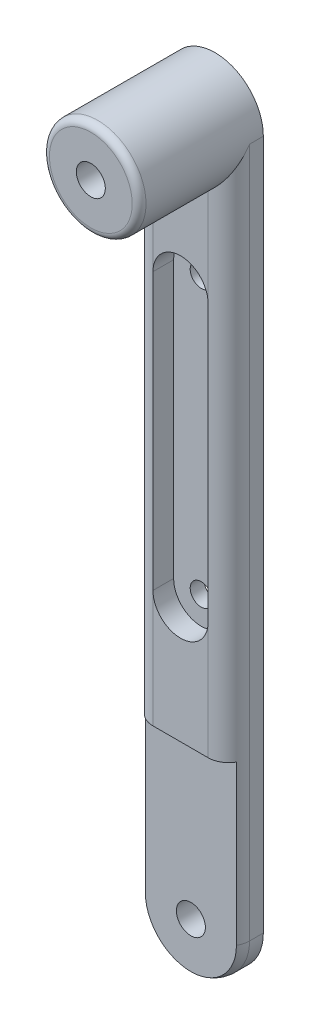
ISO-10303-21;
HEADER;
FILE_DESCRIPTION(('STEP AP214'),'2;1');
FILE_NAME('part.step','',(''),(''),'','','');
FILE_SCHEMA(('AUTOMOTIVE_DESIGN { 1 0 10303 214 1 1 1 1 }'));
ENDSEC;
DATA;
#1=APPLICATION_CONTEXT('core data for automotive mechanical design processes');
#2=APPLICATION_PROTOCOL_DEFINITION('international standard','automotive_design',2000,#1);
#3=PRODUCT_CONTEXT('',#1,'mechanical');
#4=PRODUCT('Part','Part','',(#3));
#5=PRODUCT_RELATED_PRODUCT_CATEGORY('part','',(#4));
#6=PRODUCT_DEFINITION_FORMATION('','',#4);
#7=PRODUCT_DEFINITION_CONTEXT('part definition',#1,'design');
#8=PRODUCT_DEFINITION('design','',#6,#7);
#9=PRODUCT_DEFINITION_SHAPE('','',#8);
#10=(LENGTH_UNIT() NAMED_UNIT(*) SI_UNIT(.MILLI.,.METRE.));
#11=(NAMED_UNIT(*) PLANE_ANGLE_UNIT() SI_UNIT($,.RADIAN.));
#12=(NAMED_UNIT(*) SI_UNIT($,.STERADIAN.) SOLID_ANGLE_UNIT());
#13=UNCERTAINTY_MEASURE_WITH_UNIT(LENGTH_MEASURE(1.E-05),#10,'distance_accuracy_value','');
#14=(GEOMETRIC_REPRESENTATION_CONTEXT(3) GLOBAL_UNCERTAINTY_ASSIGNED_CONTEXT((#13)) GLOBAL_UNIT_ASSIGNED_CONTEXT((#10,
#11,#12)) REPRESENTATION_CONTEXT('',''));
#15=CARTESIAN_POINT('',(0.,0.,0.));
#16=DIRECTION('',(0.,0.,1.));
#17=DIRECTION('',(1.,0.,0.));
#18=AXIS2_PLACEMENT_3D('',#15,#16,#17);
#19=CARTESIAN_POINT('',(0.,-100.,2.));
#20=DIRECTION('',(0.,0.,1.));
#21=DIRECTION('',(1.,0.,0.));
#22=AXIS2_PLACEMENT_3D('',#19,#20,#21);
#23=TOROIDAL_SURFACE('',#22,4.,3.);
#24=CARTESIAN_POINT('',(4.00000000000001,-100.,2.));
#25=DIRECTION('',(0.,-1.,0.));
#26=DIRECTION('',(0.,0.,-1.));
#27=AXIS2_PLACEMENT_3D('',#24,#25,#26);
#28=CIRCLE('',#27,3.);
#29=CARTESIAN_POINT('',(7.00000000000001,-100.,2.));
#30=VERTEX_POINT('',#29);
#31=CARTESIAN_POINT('',(6.59807621135332,-100.,3.5));
#32=VERTEX_POINT('',#31);
#33=EDGE_CURVE('E207',#30,#32,#28,.T.);
#34=ORIENTED_EDGE('',*,*,#33,.T.);
#35=CARTESIAN_POINT('',(0.,-100.,3.5));
#36=DIRECTION('',(0.,0.,1.));
#37=DIRECTION('',(1.,0.,0.));
#38=AXIS2_PLACEMENT_3D('',#35,#36,#37);
#39=CIRCLE('',#38,6.59807621135332);
#40=CARTESIAN_POINT('',(-6.59807621135331,-100.,3.5));
#41=VERTEX_POINT('',#40);
#42=EDGE_CURVE('E138',#32,#41,#39,.F.);
#43=ORIENTED_EDGE('',*,*,#42,.T.);
#44=CARTESIAN_POINT('',(-3.99999999999999,-100.,2.));
#45=DIRECTION('',(0.,-1.,0.));
#46=DIRECTION('',(0.,0.,-1.));
#47=AXIS2_PLACEMENT_3D('',#44,#45,#46);
#48=CIRCLE('',#47,3.);
#49=CARTESIAN_POINT('',(-6.99999999999999,-100.,2.));
#50=VERTEX_POINT('',#49);
#51=EDGE_CURVE('E210',#41,#50,#48,.T.);
#52=ORIENTED_EDGE('',*,*,#51,.T.);
#53=CARTESIAN_POINT('',(0.,-100.,2.));
#54=DIRECTION('',(0.,0.,1.));
#55=DIRECTION('',(1.,0.,0.));
#56=AXIS2_PLACEMENT_3D('',#53,#54,#55);
#57=CIRCLE('',#56,7.);
#58=EDGE_CURVE('E151',#30,#50,#57,.F.);
#59=ORIENTED_EDGE('',*,*,#58,.F.);
#60=EDGE_LOOP('',(#34,#43,#52,#59));
#61=FACE_BOUND('',#60,.T.);
#62=ADVANCED_FACE('F39',(#61),#23,.T.);
#63=CARTESIAN_POINT('',(0.,0.,5.));
#64=DIRECTION('',(0.,0.,1.));
#65=DIRECTION('',(1.,0.,0.));
#66=AXIS2_PLACEMENT_3D('',#63,#64,#65);
#67=PLANE('',#66);
#68=CARTESIAN_POINT('',(0.,-20.,5.));
#69=DIRECTION('',(0.,0.,1.));
#70=DIRECTION('',(1.,0.,0.));
#71=AXIS2_PLACEMENT_3D('',#68,#69,#70);
#72=CIRCLE('',#71,3.99999999999998);
#73=CARTESIAN_POINT('',(3.99999999999999,-20.,5.));
#74=VERTEX_POINT('',#73);
#75=CARTESIAN_POINT('',(-3.99999999999997,-20.,5.));
#76=VERTEX_POINT('',#75);
#77=EDGE_CURVE('E290',#74,#76,#72,.T.);
#78=ORIENTED_EDGE('',*,*,#77,.F.);
#79=DIRECTION('',(0.,1.,0.));
#80=VECTOR('',#79,1.);
#81=CARTESIAN_POINT('',(4.,0.,5.));
#82=LINE('',#81,#80);
#83=CARTESIAN_POINT('',(4.,-5.74456264653803,5.));
#84=VERTEX_POINT('',#83);
#85=EDGE_CURVE('E152',#74,#84,#82,.T.);
#86=ORIENTED_EDGE('',*,*,#85,.T.);
#87=CARTESIAN_POINT('',(0.,0.,5.));
#88=DIRECTION('',(0.,0.,1.));
#89=DIRECTION('',(1.,0.,0.));
#90=AXIS2_PLACEMENT_3D('',#87,#88,#89);
#91=CIRCLE('',#90,7.);
#92=CARTESIAN_POINT('',(-4.,-5.74456264653803,5.));
#93=VERTEX_POINT('',#92);
#94=EDGE_CURVE('E257',#93,#84,#91,.T.);
#95=ORIENTED_EDGE('',*,*,#94,.F.);
#96=DIRECTION('',(0.,-1.,0.));
#97=VECTOR('',#96,1.);
#98=CARTESIAN_POINT('',(-3.99999999999999,-100.,5.));
#99=LINE('',#98,#97);
#100=EDGE_CURVE('E157',#93,#76,#99,.T.);
#101=ORIENTED_EDGE('',*,*,#100,.T.);
#102=EDGE_LOOP('',(#78,#86,#95,#101));
#103=FACE_BOUND('',#102,.T.);
#104=ADVANCED_FACE('F197',(#103),#67,.T.);
#105=CARTESIAN_POINT('',(0.,0.,18.));
#106=DIRECTION('',(0.,0.,-1.));
#107=DIRECTION('',(-1.,0.,0.));
#108=AXIS2_PLACEMENT_3D('',#105,#106,#107);
#109=CYLINDRICAL_SURFACE('',#108,7.);
#110=CARTESIAN_POINT('',(0.,0.,17.));
#111=DIRECTION('',(0.,0.,1.));
#112=DIRECTION('',(1.,0.,0.));
#113=AXIS2_PLACEMENT_3D('',#110,#111,#112);
#114=CIRCLE('',#113,7.);
#115=CARTESIAN_POINT('',(7.,0.,17.));
#116=VERTEX_POINT('',#115);
#117=EDGE_CURVE('E11',#116,#116,#114,.F.);
#118=ORIENTED_EDGE('',*,*,#117,.T.);
#119=EDGE_LOOP('',(#118));
#120=FACE_BOUND('',#119,.T.);
#121=DIRECTION('',(0.,0.,-1.));
#122=VECTOR('',#121,1.);
#123=CARTESIAN_POINT('',(-7.,0.,5.));
#124=LINE('',#123,#122);
#125=CARTESIAN_POINT('',(-7.,0.,2.));
#126=VERTEX_POINT('',#125);
#127=CARTESIAN_POINT('',(-7.,0.,0.));
#128=VERTEX_POINT('',#127);
#129=EDGE_CURVE('E238',#126,#128,#124,.T.);
#130=ORIENTED_EDGE('',*,*,#129,.F.);
#131=CARTESIAN_POINT('',(-4.,-5.74456264653803,5.));
#132=CARTESIAN_POINT('',(-4.10560056796325,-5.67106469962434,4.99999204849266));
#133=CARTESIAN_POINT('',(-4.20905142376086,-5.59467720100948,4.99442769333087));
#134=CARTESIAN_POINT('',(-4.41080801779257,-5.43700552068477,4.97346760596443));
#135=CARTESIAN_POINT('',(-4.50912336120114,-5.35573114025841,4.9580909945642));
#136=CARTESIAN_POINT('',(-4.69917329407143,-5.18975480068039,4.91898482455378));
#137=CARTESIAN_POINT('',(-4.79096624771771,-5.10509791169259,4.89534487001315));
#138=CARTESIAN_POINT('',(-4.96884628939413,-4.9321357332573,4.84077401315519));
#139=CARTESIAN_POINT('',(-5.0549297430738,-4.84382817695736,4.8098385229041));
#140=CARTESIAN_POINT('',(-5.24998768852349,-4.6330105694876,4.72986601789085));
#141=CARTESIAN_POINT('',(-5.35656360814947,-4.50924804562533,4.67827055097875));
#142=CARTESIAN_POINT('',(-5.55893618260416,-4.25727146470626,4.5657604340252));
#143=CARTESIAN_POINT('',(-5.65473085178413,-4.12905659330491,4.50484407215645));
#144=CARTESIAN_POINT('',(-5.83621176415536,-3.86833289087036,4.37504527308633));
#145=CARTESIAN_POINT('',(-5.92183863028728,-3.73580409442229,4.30612028884907));
#146=CARTESIAN_POINT('',(-6.08264567432005,-3.46783086204423,4.16200073185211));
#147=CARTESIAN_POINT('',(-6.15782273871987,-3.33238557097271,4.08680430115732));
#148=CARTESIAN_POINT('',(-6.32685567517654,-3.00297512190633,3.89936148940422));
#149=CARTESIAN_POINT('',(-6.41567942504996,-2.80785026043894,3.78459565275172));
#150=CARTESIAN_POINT('',(-6.57392969805323,-2.41422354712003,3.54764095417837));
#151=CARTESIAN_POINT('',(-6.64334692994569,-2.21572012580261,3.42544857062339));
#152=CARTESIAN_POINT('',(-6.76333415409406,-1.81676080636745,3.17605094483991));
#153=CARTESIAN_POINT('',(-6.81393867500258,-1.61630918509485,3.04885536486981));
#154=CARTESIAN_POINT('',(-6.89698633772744,-1.2139797240236,2.79107276025933));
#155=CARTESIAN_POINT('',(-6.92943852375573,-1.01210264530744,2.66048745851133));
#156=CARTESIAN_POINT('',(-6.96842425819762,-0.677380108501033,2.44284499860543));
#157=CARTESIAN_POINT('',(-6.98003745073094,-0.54475385437928,2.35631798354302));
#158=CARTESIAN_POINT('',(-6.99568259306756,-0.279411950065175,2.18291291800331));
#159=CARTESIAN_POINT('',(-6.9997206298678,-0.14669645744637,2.09603520563809));
#160=CARTESIAN_POINT('',(-6.99999533256514,-0.0093333097778525,2.00611008573063));
#161=CARTESIAN_POINT('',(-6.99999999911157,-0.00466664057309182,2.00305503339743));
#162=CARTESIAN_POINT('',(-7.,0.,2.));
#163=B_SPLINE_CURVE_WITH_KNOTS('',3,(#131,#132,#133,#134,#135,#136,#137,#138,#139,#140,#141,
#142,#143,#144,#145,#146,#147,#148,#149,#150,#151,#152,#153,#154,#155,#156,#157,#158,#159,#160,
#161,#162),.UNSPECIFIED.,.F.,.F.,(4,2,2,2,2,2,2,2,2,2,2,2,2,2,2,4),(0.,0.38564717377713,
0.770545135607862,1.15139266981324,1.53248034878109,2.04556248030352,2.55873895518642,
3.07477846543134,3.5909714007265,4.31944082591672,5.04825842465059,5.77573167663153,
6.50284214904388,6.97903025788018,7.45483556281199,7.47156876920095),.UNSPECIFIED.);
#164=EDGE_CURVE('E172',#126,#93,#163,.F.);
#165=ORIENTED_EDGE('',*,*,#164,.T.);
#166=ORIENTED_EDGE('',*,*,#94,.T.);
#167=CARTESIAN_POINT('',(4.,-5.74456264653803,5.));
#168=CARTESIAN_POINT('',(4.10560056796326,-5.67106469962434,4.99999204849266));
#169=CARTESIAN_POINT('',(4.20905142376086,-5.59467720100947,4.99442769333087));
#170=CARTESIAN_POINT('',(4.41080801779257,-5.43700552068477,4.97346760596443));
#171=CARTESIAN_POINT('',(4.50912336120114,-5.35573114025841,4.9580909945642));
#172=CARTESIAN_POINT('',(4.69917329407143,-5.18975480068039,4.91898482455378));
#173=CARTESIAN_POINT('',(4.79096624771772,-5.10509791169259,4.89534487001315));
#174=CARTESIAN_POINT('',(4.96884628939413,-4.9321357332573,4.84077401315519));
#175=CARTESIAN_POINT('',(5.0549297430738,-4.84382817695736,4.8098385229041));
#176=CARTESIAN_POINT('',(5.24998768852349,-4.6330105694876,4.72986601789085));
#177=CARTESIAN_POINT('',(5.35656360814947,-4.50924804562533,4.67827055097875));
#178=CARTESIAN_POINT('',(5.55893618260416,-4.25727146470626,4.5657604340252));
#179=CARTESIAN_POINT('',(5.65473085178413,-4.12905659330491,4.50484407215645));
#180=CARTESIAN_POINT('',(5.83621176415536,-3.86833289087036,4.37504527308633));
#181=CARTESIAN_POINT('',(5.92183863028728,-3.73580409442229,4.30612028884907));
#182=CARTESIAN_POINT('',(6.08264567432005,-3.46783086204423,4.16200073185211));
#183=CARTESIAN_POINT('',(6.15782273871987,-3.33238557097271,4.08680430115732));
#184=CARTESIAN_POINT('',(6.32685567517654,-3.00297512190633,3.89936148940423));
#185=CARTESIAN_POINT('',(6.41567942504996,-2.80785026043894,3.78459565275172));
#186=CARTESIAN_POINT('',(6.57392969805323,-2.41422354712003,3.54764095417837));
#187=CARTESIAN_POINT('',(6.64334692994569,-2.21572012580261,3.42544857062339));
#188=CARTESIAN_POINT('',(6.76333415409406,-1.81676080636745,3.17605094483991));
#189=CARTESIAN_POINT('',(6.81393867500258,-1.61630918509485,3.04885536486981));
#190=CARTESIAN_POINT('',(6.89698633772744,-1.2139797240236,2.79107276025933));
#191=CARTESIAN_POINT('',(6.92943852375573,-1.01210264530744,2.66048745851133));
#192=CARTESIAN_POINT('',(6.96842425819762,-0.677380108501032,2.44284499860543));
#193=CARTESIAN_POINT('',(6.98003745073094,-0.544753854379276,2.35631798354303));
#194=CARTESIAN_POINT('',(6.99568259306756,-0.27941195006518,2.1829129180033));
#195=CARTESIAN_POINT('',(6.9997206298678,-0.146696457446387,2.09603520563806));
#196=CARTESIAN_POINT('',(6.99999533256514,-0.00933330977785193,2.00611008573063));
#197=CARTESIAN_POINT('',(6.99999999911157,-0.0046666405730907,2.00305503339743));
#198=CARTESIAN_POINT('',(7.,0.,2.));
#199=B_SPLINE_CURVE_WITH_KNOTS('',3,(#167,#168,#169,#170,#171,#172,#173,#174,#175,#176,#177,
#178,#179,#180,#181,#182,#183,#184,#185,#186,#187,#188,#189,#190,#191,#192,#193,#194,#195,#196,
#197,#198),.UNSPECIFIED.,.F.,.F.,(4,2,2,2,2,2,2,2,2,2,2,2,2,2,2,4),(0.,0.38564717377713,
0.770545135607862,1.15139266981324,1.53248034878109,2.04556248030352,2.55873895518642,
3.07477846543134,3.5909714007265,4.31944082591671,5.04825842465059,5.77573167663153,
6.50284214904387,6.97903025788018,7.45483556281199,7.47156876920095),.UNSPECIFIED.);
#200=CARTESIAN_POINT('',(7.,0.,2.));
#201=VERTEX_POINT('',#200);
#202=EDGE_CURVE('E164',#84,#201,#199,.T.);
#203=ORIENTED_EDGE('',*,*,#202,.T.);
#204=DIRECTION('',(0.,0.,-1.));
#205=VECTOR('',#204,1.);
#206=CARTESIAN_POINT('',(7.,0.,5.));
#207=LINE('',#206,#205);
#208=CARTESIAN_POINT('',(7.,0.,0.));
#209=VERTEX_POINT('',#208);
#210=EDGE_CURVE('E247',#201,#209,#207,.T.);
#211=ORIENTED_EDGE('',*,*,#210,.T.);
#212=CARTESIAN_POINT('',(0.,0.,0.));
#213=DIRECTION('',(0.,0.,1.));
#214=DIRECTION('',(1.,0.,0.));
#215=AXIS2_PLACEMENT_3D('',#212,#213,#214);
#216=CIRCLE('',#215,7.);
#217=EDGE_CURVE('E243',#209,#128,#216,.T.);
#218=ORIENTED_EDGE('',*,*,#217,.T.);
#219=EDGE_LOOP('',(#130,#165,#166,#203,#211,#218));
#220=FACE_BOUND('',#219,.T.);
#221=ADVANCED_FACE('F178',(#120,#220),#109,.T.);
#222=CARTESIAN_POINT('',(0.,0.,18.));
#223=DIRECTION('',(0.,0.,1.));
#224=DIRECTION('',(1.,0.,0.));
#225=AXIS2_PLACEMENT_3D('',#222,#223,#224);
#226=PLANE('',#225);
#227=CARTESIAN_POINT('',(0.,0.,18.));
#228=DIRECTION('',(0.,0.,1.));
#229=DIRECTION('',(1.,0.,0.));
#230=AXIS2_PLACEMENT_3D('',#227,#228,#229);
#231=CIRCLE('',#230,6.);
#232=CARTESIAN_POINT('',(6.,0.,18.));
#233=VERTEX_POINT('',#232);
#234=EDGE_CURVE('E47',#233,#233,#231,.T.);
#235=ORIENTED_EDGE('',*,*,#234,.T.);
#236=EDGE_LOOP('',(#235));
#237=FACE_BOUND('',#236,.T.);
#238=CARTESIAN_POINT('',(0.,0.,18.));
#239=DIRECTION('',(0.,0.,1.));
#240=DIRECTION('',(1.,0.,0.));
#241=AXIS2_PLACEMENT_3D('',#238,#239,#240);
#242=CIRCLE('',#241,2.1);
#243=CARTESIAN_POINT('',(2.1,0.,18.));
#244=VERTEX_POINT('',#243);
#245=EDGE_CURVE('E271',#244,#244,#242,.T.);
#246=ORIENTED_EDGE('',*,*,#245,.F.);
#247=EDGE_LOOP('',(#246));
#248=FACE_BOUND('',#247,.T.);
#249=ADVANCED_FACE('F220',(#237,#248),#226,.T.);
#250=CARTESIAN_POINT('',(0.,0.,0.));
#251=DIRECTION('',(0.,0.,1.));
#252=DIRECTION('',(1.,0.,0.));
#253=AXIS2_PLACEMENT_3D('',#250,#251,#252);
#254=PLANE('',#253);
#255=CARTESIAN_POINT('',(0.,-100.,0.));
#256=DIRECTION('',(0.,0.,1.));
#257=DIRECTION('',(1.,0.,0.));
#258=AXIS2_PLACEMENT_3D('',#255,#256,#257);
#259=CIRCLE('',#258,2.1);
#260=CARTESIAN_POINT('',(2.1,-100.,0.));
#261=VERTEX_POINT('',#260);
#262=EDGE_CURVE('E144',#261,#261,#259,.T.);
#263=ORIENTED_EDGE('',*,*,#262,.T.);
#264=EDGE_LOOP('',(#263));
#265=FACE_BOUND('',#264,.T.);
#266=CARTESIAN_POINT('',(0.,-20.,0.));
#267=DIRECTION('',(0.,0.,1.));
#268=DIRECTION('',(1.,0.,0.));
#269=AXIS2_PLACEMENT_3D('',#266,#267,#268);
#270=CIRCLE('',#269,1.6);
#271=CARTESIAN_POINT('',(1.59999999999999,-20.,0.));
#272=VERTEX_POINT('',#271);
#273=EDGE_CURVE('E293',#272,#272,#270,.T.);
#274=ORIENTED_EDGE('',*,*,#273,.T.);
#275=EDGE_LOOP('',(#274));
#276=FACE_BOUND('',#275,.T.);
#277=CARTESIAN_POINT('',(0.,-60.,0.));
#278=DIRECTION('',(0.,0.,1.));
#279=DIRECTION('',(1.,0.,0.));
#280=AXIS2_PLACEMENT_3D('',#277,#278,#279);
#281=CIRCLE('',#280,1.6);
#282=CARTESIAN_POINT('',(1.59999999999999,-60.,0.));
#283=VERTEX_POINT('',#282);
#284=EDGE_CURVE('E306',#283,#283,#281,.T.);
#285=ORIENTED_EDGE('',*,*,#284,.T.);
#286=EDGE_LOOP('',(#285));
#287=FACE_BOUND('',#286,.T.);
#288=CARTESIAN_POINT('',(0.,0.,0.));
#289=DIRECTION('',(0.,0.,1.));
#290=DIRECTION('',(1.,0.,0.));
#291=AXIS2_PLACEMENT_3D('',#288,#289,#290);
#292=CIRCLE('',#291,2.1);
#293=CARTESIAN_POINT('',(2.1,0.,0.));
#294=VERTEX_POINT('',#293);
#295=EDGE_CURVE('E270',#294,#294,#292,.T.);
#296=ORIENTED_EDGE('',*,*,#295,.T.);
#297=EDGE_LOOP('',(#296));
#298=FACE_BOUND('',#297,.T.);
#299=DIRECTION('',(0.,1.,0.));
#300=VECTOR('',#299,1.);
#301=CARTESIAN_POINT('',(7.,0.,0.));
#302=LINE('',#301,#300);
#303=CARTESIAN_POINT('',(7.00000000000001,-100.,0.));
#304=VERTEX_POINT('',#303);
#305=EDGE_CURVE('E248',#304,#209,#302,.T.);
#306=ORIENTED_EDGE('',*,*,#305,.F.);
#307=CARTESIAN_POINT('',(0.,-100.,0.));
#308=DIRECTION('',(0.,0.,1.));
#309=DIRECTION('',(1.,0.,0.));
#310=AXIS2_PLACEMENT_3D('',#307,#308,#309);
#311=CIRCLE('',#310,7.);
#312=CARTESIAN_POINT('',(-7.,-100.,0.));
#313=VERTEX_POINT('',#312);
#314=EDGE_CURVE('E212',#313,#304,#311,.T.);
#315=ORIENTED_EDGE('',*,*,#314,.F.);
#316=DIRECTION('',(0.,-1.,0.));
#317=VECTOR('',#316,1.);
#318=CARTESIAN_POINT('',(-7.,0.,0.));
#319=LINE('',#318,#317);
#320=EDGE_CURVE('E268',#128,#313,#319,.T.);
#321=ORIENTED_EDGE('',*,*,#320,.F.);
#322=ORIENTED_EDGE('',*,*,#217,.F.);
#323=EDGE_LOOP('',(#306,#315,#321,#322));
#324=FACE_BOUND('',#323,.T.);
#325=ADVANCED_FACE('F336',(#265,#276,#287,#298,#324),#254,.F.);
#326=CARTESIAN_POINT('',(-7.,0.,5.));
#327=DIRECTION('',(1.,0.,0.));
#328=DIRECTION('',(0.,1.,0.));
#329=AXIS2_PLACEMENT_3D('',#326,#327,#328);
#330=PLANE('',#329);
#331=DIRECTION('',(0.,0.,-1.));
#332=VECTOR('',#331,1.);
#333=CARTESIAN_POINT('',(-6.99999999999999,-100.,5.));
#334=LINE('',#333,#332);
#335=EDGE_CURVE('E259',#50,#313,#334,.T.);
#336=ORIENTED_EDGE('',*,*,#335,.F.);
#337=DIRECTION('',(0.,-1.,0.));
#338=VECTOR('',#337,1.);
#339=CARTESIAN_POINT('',(-7.,0.,2.));
#340=LINE('',#339,#338);
#341=EDGE_CURVE('E162',#50,#126,#340,.F.);
#342=ORIENTED_EDGE('',*,*,#341,.T.);
#343=ORIENTED_EDGE('',*,*,#129,.T.);
#344=ORIENTED_EDGE('',*,*,#320,.T.);
#345=EDGE_LOOP('',(#336,#342,#343,#344));
#346=FACE_BOUND('',#345,.T.);
#347=ADVANCED_FACE('F333',(#346),#330,.F.);
#348=CARTESIAN_POINT('',(7.,0.,5.));
#349=DIRECTION('',(-1.,0.,0.));
#350=DIRECTION('',(0.,-1.,0.));
#351=AXIS2_PLACEMENT_3D('',#348,#349,#350);
#352=PLANE('',#351);
#353=ORIENTED_EDGE('',*,*,#210,.F.);
#354=DIRECTION('',(0.,1.,0.));
#355=VECTOR('',#354,1.);
#356=CARTESIAN_POINT('',(7.00000000000001,-100.,2.));
#357=LINE('',#356,#355);
#358=EDGE_CURVE('E155',#201,#30,#357,.F.);
#359=ORIENTED_EDGE('',*,*,#358,.T.);
#360=DIRECTION('',(0.,0.,-1.));
#361=VECTOR('',#360,1.);
#362=CARTESIAN_POINT('',(7.00000000000001,-100.,5.));
#363=LINE('',#362,#361);
#364=EDGE_CURVE('E263',#30,#304,#363,.T.);
#365=ORIENTED_EDGE('',*,*,#364,.T.);
#366=ORIENTED_EDGE('',*,*,#305,.T.);
#367=EDGE_LOOP('',(#353,#359,#365,#366));
#368=FACE_BOUND('',#367,.T.);
#369=ADVANCED_FACE('F339',(#368),#352,.F.);
#370=DIRECTION('',(-1.,0.,0.));
#371=VECTOR('',#370,1.);
#372=CARTESIAN_POINT('',(-6.99999999999999,-77.,5.));
#373=LINE('',#372,#371);
#374=CARTESIAN_POINT('',(4.00000000000001,-77.,5.));
#375=VERTEX_POINT('',#374);
#376=CARTESIAN_POINT('',(-3.99999999999999,-77.,5.));
#377=VERTEX_POINT('',#376);
#378=EDGE_CURVE('E133',#375,#377,#373,.T.);
#379=ORIENTED_EDGE('',*,*,#378,.F.);
#380=CARTESIAN_POINT('',(4.00000000000001,-60.,5.));
#381=VERTEX_POINT('',#380);
#382=EDGE_CURVE('E62',#375,#381,#82,.T.);
#383=ORIENTED_EDGE('',*,*,#382,.T.);
#384=CARTESIAN_POINT('',(0.,-60.,5.));
#385=DIRECTION('',(0.,0.,1.));
#386=DIRECTION('',(1.,0.,0.));
#387=AXIS2_PLACEMENT_3D('',#384,#385,#386);
#388=CIRCLE('',#387,3.99999999999998);
#389=CARTESIAN_POINT('',(-3.99999999999999,-60.,5.));
#390=VERTEX_POINT('',#389);
#391=EDGE_CURVE('E287',#390,#381,#388,.T.);
#392=ORIENTED_EDGE('',*,*,#391,.F.);
#393=EDGE_CURVE('E143',#390,#377,#99,.T.);
#394=ORIENTED_EDGE('',*,*,#393,.T.);
#395=EDGE_LOOP('',(#379,#383,#392,#394));
#396=FACE_BOUND('',#395,.T.);
#397=ADVANCED_FACE('F141',(#396),#67,.T.);
#398=CARTESIAN_POINT('',(0.,0.,0.));
#399=DIRECTION('',(0.,0.,1.));
#400=DIRECTION('',(1.,0.,0.));
#401=AXIS2_PLACEMENT_3D('',#398,#399,#400);
#402=CYLINDRICAL_SURFACE('',#401,2.1);
#403=ORIENTED_EDGE('',*,*,#295,.F.);
#404=EDGE_LOOP('',(#403));
#405=FACE_BOUND('',#404,.T.);
#406=ORIENTED_EDGE('',*,*,#245,.T.);
#407=EDGE_LOOP('',(#406));
#408=FACE_BOUND('',#407,.T.);
#409=ADVANCED_FACE('F193',(#405,#408),#402,.F.);
#410=CARTESIAN_POINT('',(0.,-100.,0.));
#411=DIRECTION('',(0.,0.,1.));
#412=DIRECTION('',(1.,0.,0.));
#413=AXIS2_PLACEMENT_3D('',#410,#411,#412);
#414=CYLINDRICAL_SURFACE('',#413,7.);
#415=ORIENTED_EDGE('',*,*,#364,.F.);
#416=ORIENTED_EDGE('',*,*,#58,.T.);
#417=ORIENTED_EDGE('',*,*,#335,.T.);
#418=ORIENTED_EDGE('',*,*,#314,.T.);
#419=EDGE_LOOP('',(#415,#416,#417,#418));
#420=FACE_BOUND('',#419,.T.);
#421=ADVANCED_FACE('F188',(#420),#414,.T.);
#422=CARTESIAN_POINT('',(-4.,0.,2.));
#423=DIRECTION('',(0.,1.,0.));
#424=DIRECTION('',(-1.,0.,0.));
#425=AXIS2_PLACEMENT_3D('',#422,#423,#424);
#426=CYLINDRICAL_SURFACE('',#425,3.);
#427=CARTESIAN_POINT('',(-3.99999999999999,-77.,2.));
#428=DIRECTION('',(0.,1.,0.));
#429=DIRECTION('',(0.,0.,1.));
#430=AXIS2_PLACEMENT_3D('',#427,#428,#429);
#431=CIRCLE('',#430,3.);
#432=CARTESIAN_POINT('',(-6.59807621135331,-77.,3.5));
#433=VERTEX_POINT('',#432);
#434=EDGE_CURVE('E313',#377,#433,#431,.F.);
#435=ORIENTED_EDGE('',*,*,#434,.F.);
#436=ORIENTED_EDGE('',*,*,#393,.F.);
#437=DIRECTION('',(0.,-1.,0.));
#438=VECTOR('',#437,1.);
#439=CARTESIAN_POINT('',(-3.99999999999997,-20.,5.));
#440=LINE('',#439,#438);
#441=EDGE_CURVE('E255',#76,#390,#440,.T.);
#442=ORIENTED_EDGE('',*,*,#441,.F.);
#443=ORIENTED_EDGE('',*,*,#100,.F.);
#444=ORIENTED_EDGE('',*,*,#164,.F.);
#445=ORIENTED_EDGE('',*,*,#341,.F.);
#446=ORIENTED_EDGE('',*,*,#51,.F.);
#447=DIRECTION('',(0.,1.,0.));
#448=VECTOR('',#447,1.);
#449=CARTESIAN_POINT('',(-6.59807621135332,0.,3.5));
#450=LINE('',#449,#448);
#451=EDGE_CURVE('E54',#41,#433,#450,.T.);
#452=ORIENTED_EDGE('',*,*,#451,.T.);
#453=EDGE_LOOP('',(#435,#436,#442,#443,#444,#445,#446,#452));
#454=FACE_BOUND('',#453,.T.);
#455=ADVANCED_FACE('F185',(#454),#426,.T.);
#456=CARTESIAN_POINT('',(4.,0.,2.));
#457=DIRECTION('',(0.,-1.,0.));
#458=DIRECTION('',(1.,0.,0.));
#459=AXIS2_PLACEMENT_3D('',#456,#457,#458);
#460=CYLINDRICAL_SURFACE('',#459,3.);
#461=CARTESIAN_POINT('',(4.00000000000001,-77.,2.));
#462=DIRECTION('',(0.,1.,0.));
#463=DIRECTION('',(0.,0.,1.));
#464=AXIS2_PLACEMENT_3D('',#461,#462,#463);
#465=CIRCLE('',#464,3.);
#466=CARTESIAN_POINT('',(6.59807621135333,-77.,3.5));
#467=VERTEX_POINT('',#466);
#468=EDGE_CURVE('E131',#467,#375,#465,.F.);
#469=ORIENTED_EDGE('',*,*,#468,.F.);
#470=DIRECTION('',(0.,-1.,0.));
#471=VECTOR('',#470,1.);
#472=CARTESIAN_POINT('',(6.59807621135332,0.,3.5));
#473=LINE('',#472,#471);
#474=EDGE_CURVE('E318',#467,#32,#473,.T.);
#475=ORIENTED_EDGE('',*,*,#474,.T.);
#476=ORIENTED_EDGE('',*,*,#33,.F.);
#477=ORIENTED_EDGE('',*,*,#358,.F.);
#478=ORIENTED_EDGE('',*,*,#202,.F.);
#479=ORIENTED_EDGE('',*,*,#85,.F.);
#480=DIRECTION('',(0.,1.,0.));
#481=VECTOR('',#480,1.);
#482=CARTESIAN_POINT('',(3.99999999999999,-20.,5.));
#483=LINE('',#482,#481);
#484=EDGE_CURVE('E150',#381,#74,#483,.T.);
#485=ORIENTED_EDGE('',*,*,#484,.F.);
#486=ORIENTED_EDGE('',*,*,#382,.F.);
#487=EDGE_LOOP('',(#469,#475,#476,#477,#478,#479,#485,#486));
#488=FACE_BOUND('',#487,.T.);
#489=ADVANCED_FACE('F147',(#488),#460,.T.);
#490=CARTESIAN_POINT('',(0.,-20.,2.));
#491=DIRECTION('',(0.,0.,1.));
#492=DIRECTION('',(1.,0.,0.));
#493=AXIS2_PLACEMENT_3D('',#490,#491,#492);
#494=CYLINDRICAL_SURFACE('',#493,3.99999999999998);
#495=ORIENTED_EDGE('',*,*,#77,.T.);
#496=DIRECTION('',(0.,0.,1.));
#497=VECTOR('',#496,1.);
#498=CARTESIAN_POINT('',(-3.99999999999997,-20.,2.));
#499=LINE('',#498,#497);
#500=CARTESIAN_POINT('',(-3.99999999999997,-20.,2.));
#501=VERTEX_POINT('',#500);
#502=EDGE_CURVE('E278',#501,#76,#499,.T.);
#503=ORIENTED_EDGE('',*,*,#502,.F.);
#504=CARTESIAN_POINT('',(0.,-20.,2.));
#505=DIRECTION('',(0.,0.,1.));
#506=DIRECTION('',(1.,0.,0.));
#507=AXIS2_PLACEMENT_3D('',#504,#505,#506);
#508=CIRCLE('',#507,3.99999999999998);
#509=CARTESIAN_POINT('',(3.99999999999999,-20.,2.));
#510=VERTEX_POINT('',#509);
#511=EDGE_CURVE('E286',#510,#501,#508,.T.);
#512=ORIENTED_EDGE('',*,*,#511,.F.);
#513=DIRECTION('',(0.,0.,1.));
#514=VECTOR('',#513,1.);
#515=CARTESIAN_POINT('',(3.99999999999999,-20.,2.));
#516=LINE('',#515,#514);
#517=EDGE_CURVE('E211',#510,#74,#516,.T.);
#518=ORIENTED_EDGE('',*,*,#517,.T.);
#519=EDGE_LOOP('',(#495,#503,#512,#518));
#520=FACE_BOUND('',#519,.T.);
#521=ADVANCED_FACE('F184',(#520),#494,.F.);
#522=CARTESIAN_POINT('',(3.99999999999999,-20.,2.));
#523=DIRECTION('',(1.,0.,0.));
#524=DIRECTION('',(0.,1.,0.));
#525=AXIS2_PLACEMENT_3D('',#522,#523,#524);
#526=PLANE('',#525);
#527=ORIENTED_EDGE('',*,*,#484,.T.);
#528=ORIENTED_EDGE('',*,*,#517,.F.);
#529=DIRECTION('',(0.,1.,0.));
#530=VECTOR('',#529,1.);
#531=CARTESIAN_POINT('',(3.99999999999999,-20.,2.));
#532=LINE('',#531,#530);
#533=CARTESIAN_POINT('',(3.99999999999998,-60.,2.));
#534=VERTEX_POINT('',#533);
#535=EDGE_CURVE('E281',#534,#510,#532,.T.);
#536=ORIENTED_EDGE('',*,*,#535,.F.);
#537=DIRECTION('',(0.,0.,1.));
#538=VECTOR('',#537,1.);
#539=CARTESIAN_POINT('',(3.99999999999998,-60.,2.));
#540=LINE('',#539,#538);
#541=EDGE_CURVE('E214',#534,#381,#540,.T.);
#542=ORIENTED_EDGE('',*,*,#541,.T.);
#543=EDGE_LOOP('',(#527,#528,#536,#542));
#544=FACE_BOUND('',#543,.T.);
#545=ADVANCED_FACE('F345',(#544),#526,.F.);
#546=CARTESIAN_POINT('',(0.,-60.,2.));
#547=DIRECTION('',(0.,0.,1.));
#548=DIRECTION('',(1.,0.,0.));
#549=AXIS2_PLACEMENT_3D('',#546,#547,#548);
#550=CYLINDRICAL_SURFACE('',#549,3.99999999999998);
#551=ORIENTED_EDGE('',*,*,#391,.T.);
#552=ORIENTED_EDGE('',*,*,#541,.F.);
#553=CARTESIAN_POINT('',(0.,-60.,2.));
#554=DIRECTION('',(0.,0.,1.));
#555=DIRECTION('',(1.,0.,0.));
#556=AXIS2_PLACEMENT_3D('',#553,#554,#555);
#557=CIRCLE('',#556,3.99999999999998);
#558=CARTESIAN_POINT('',(-3.99999999999999,-60.,2.));
#559=VERTEX_POINT('',#558);
#560=EDGE_CURVE('E296',#559,#534,#557,.T.);
#561=ORIENTED_EDGE('',*,*,#560,.F.);
#562=DIRECTION('',(0.,0.,1.));
#563=VECTOR('',#562,1.);
#564=CARTESIAN_POINT('',(-3.99999999999999,-60.,2.));
#565=LINE('',#564,#563);
#566=EDGE_CURVE('E280',#559,#390,#565,.T.);
#567=ORIENTED_EDGE('',*,*,#566,.T.);
#568=EDGE_LOOP('',(#551,#552,#561,#567));
#569=FACE_BOUND('',#568,.T.);
#570=ADVANCED_FACE('F348',(#569),#550,.F.);
#571=CARTESIAN_POINT('',(-3.99999999999997,-20.,2.));
#572=DIRECTION('',(-1.,0.,0.));
#573=DIRECTION('',(0.,-1.,0.));
#574=AXIS2_PLACEMENT_3D('',#571,#572,#573);
#575=PLANE('',#574);
#576=ORIENTED_EDGE('',*,*,#441,.T.);
#577=ORIENTED_EDGE('',*,*,#566,.F.);
#578=DIRECTION('',(0.,-1.,0.));
#579=VECTOR('',#578,1.);
#580=CARTESIAN_POINT('',(-3.99999999999997,-20.,2.));
#581=LINE('',#580,#579);
#582=EDGE_CURVE('E299',#501,#559,#581,.T.);
#583=ORIENTED_EDGE('',*,*,#582,.F.);
#584=ORIENTED_EDGE('',*,*,#502,.T.);
#585=EDGE_LOOP('',(#576,#577,#583,#584));
#586=FACE_BOUND('',#585,.T.);
#587=ADVANCED_FACE('F352',(#586),#575,.F.);
#588=CARTESIAN_POINT('',(0.,-20.,2.));
#589=DIRECTION('',(0.,0.,1.));
#590=DIRECTION('',(1.,0.,0.));
#591=AXIS2_PLACEMENT_3D('',#588,#589,#590);
#592=PLANE('',#591);
#593=CARTESIAN_POINT('',(0.,-20.,2.));
#594=DIRECTION('',(0.,0.,1.));
#595=DIRECTION('',(1.,0.,0.));
#596=AXIS2_PLACEMENT_3D('',#593,#594,#595);
#597=CIRCLE('',#596,1.6);
#598=CARTESIAN_POINT('',(1.59999999999999,-20.,2.));
#599=VERTEX_POINT('',#598);
#600=EDGE_CURVE('E309',#599,#599,#597,.T.);
#601=ORIENTED_EDGE('',*,*,#600,.F.);
#602=EDGE_LOOP('',(#601));
#603=FACE_BOUND('',#602,.T.);
#604=CARTESIAN_POINT('',(0.,-60.,2.));
#605=DIRECTION('',(0.,0.,1.));
#606=DIRECTION('',(1.,0.,0.));
#607=AXIS2_PLACEMENT_3D('',#604,#605,#606);
#608=CIRCLE('',#607,1.6);
#609=CARTESIAN_POINT('',(1.59999999999999,-60.,2.));
#610=VERTEX_POINT('',#609);
#611=EDGE_CURVE('E310',#610,#610,#608,.T.);
#612=ORIENTED_EDGE('',*,*,#611,.F.);
#613=EDGE_LOOP('',(#612));
#614=FACE_BOUND('',#613,.T.);
#615=ORIENTED_EDGE('',*,*,#511,.T.);
#616=ORIENTED_EDGE('',*,*,#582,.T.);
#617=ORIENTED_EDGE('',*,*,#560,.T.);
#618=ORIENTED_EDGE('',*,*,#535,.T.);
#619=EDGE_LOOP('',(#615,#616,#617,#618));
#620=FACE_BOUND('',#619,.T.);
#621=ADVANCED_FACE('F350',(#603,#614,#620),#592,.T.);
#622=CARTESIAN_POINT('',(0.,-60.,-1.));
#623=DIRECTION('',(0.,0.,1.));
#624=DIRECTION('',(1.,0.,0.));
#625=AXIS2_PLACEMENT_3D('',#622,#623,#624);
#626=CYLINDRICAL_SURFACE('',#625,1.6);
#627=ORIENTED_EDGE('',*,*,#611,.T.);
#628=EDGE_LOOP('',(#627));
#629=FACE_BOUND('',#628,.T.);
#630=ORIENTED_EDGE('',*,*,#284,.F.);
#631=EDGE_LOOP('',(#630));
#632=FACE_BOUND('',#631,.T.);
#633=ADVANCED_FACE('F359',(#629,#632),#626,.F.);
#634=CARTESIAN_POINT('',(0.,-20.,-1.));
#635=DIRECTION('',(0.,0.,1.));
#636=DIRECTION('',(1.,0.,0.));
#637=AXIS2_PLACEMENT_3D('',#634,#635,#636);
#638=CYLINDRICAL_SURFACE('',#637,1.6);
#639=ORIENTED_EDGE('',*,*,#600,.T.);
#640=EDGE_LOOP('',(#639));
#641=FACE_BOUND('',#640,.T.);
#642=ORIENTED_EDGE('',*,*,#273,.F.);
#643=EDGE_LOOP('',(#642));
#644=FACE_BOUND('',#643,.T.);
#645=ADVANCED_FACE('F391',(#641,#644),#638,.F.);
#646=CARTESIAN_POINT('',(-6.99999999999999,-77.,3.5));
#647=DIRECTION('',(0.,1.,0.));
#648=DIRECTION('',(0.,0.,1.));
#649=AXIS2_PLACEMENT_3D('',#646,#647,#648);
#650=PLANE('',#649);
#651=ORIENTED_EDGE('',*,*,#434,.T.);
#652=DIRECTION('',(-1.,0.,0.));
#653=VECTOR('',#652,1.);
#654=CARTESIAN_POINT('',(-6.99999999999999,-77.,3.5));
#655=LINE('',#654,#653);
#656=EDGE_CURVE('E135',#467,#433,#655,.T.);
#657=ORIENTED_EDGE('',*,*,#656,.F.);
#658=ORIENTED_EDGE('',*,*,#468,.T.);
#659=ORIENTED_EDGE('',*,*,#378,.T.);
#660=EDGE_LOOP('',(#651,#657,#658,#659));
#661=FACE_BOUND('',#660,.T.);
#662=ADVANCED_FACE('F132',(#661),#650,.F.);
#663=CARTESIAN_POINT('',(0.,0.,3.5));
#664=DIRECTION('',(0.,0.,1.));
#665=DIRECTION('',(1.,0.,0.));
#666=AXIS2_PLACEMENT_3D('',#663,#664,#665);
#667=PLANE('',#666);
#668=CARTESIAN_POINT('',(0.,-100.,3.5));
#669=DIRECTION('',(0.,0.,1.));
#670=DIRECTION('',(1.,0.,0.));
#671=AXIS2_PLACEMENT_3D('',#668,#669,#670);
#672=CIRCLE('',#671,2.1);
#673=CARTESIAN_POINT('',(2.1,-100.,3.5));
#674=VERTEX_POINT('',#673);
#675=EDGE_CURVE('E323',#674,#674,#672,.T.);
#676=ORIENTED_EDGE('',*,*,#675,.F.);
#677=EDGE_LOOP('',(#676));
#678=FACE_BOUND('',#677,.T.);
#679=ORIENTED_EDGE('',*,*,#42,.F.);
#680=ORIENTED_EDGE('',*,*,#474,.F.);
#681=ORIENTED_EDGE('',*,*,#656,.T.);
#682=ORIENTED_EDGE('',*,*,#451,.F.);
#683=EDGE_LOOP('',(#679,#680,#681,#682));
#684=FACE_BOUND('',#683,.T.);
#685=ADVANCED_FACE('F229',(#678,#684),#667,.T.);
#686=CARTESIAN_POINT('',(0.,-100.,-0.5));
#687=DIRECTION('',(0.,0.,1.));
#688=DIRECTION('',(1.,0.,0.));
#689=AXIS2_PLACEMENT_3D('',#686,#687,#688);
#690=CYLINDRICAL_SURFACE('',#689,2.1);
#691=ORIENTED_EDGE('',*,*,#675,.T.);
#692=EDGE_LOOP('',(#691));
#693=FACE_BOUND('',#692,.T.);
#694=ORIENTED_EDGE('',*,*,#262,.F.);
#695=EDGE_LOOP('',(#694));
#696=FACE_BOUND('',#695,.T.);
#697=ADVANCED_FACE('F224',(#693,#696),#690,.F.);
#698=CARTESIAN_POINT('',(0.,0.,17.));
#699=DIRECTION('',(0.,0.,1.));
#700=DIRECTION('',(1.,0.,0.));
#701=AXIS2_PLACEMENT_3D('',#698,#699,#700);
#702=TOROIDAL_SURFACE('',#701,6.,1.);
#703=ORIENTED_EDGE('',*,*,#117,.F.);
#704=EDGE_LOOP('',(#703));
#705=FACE_BOUND('',#704,.T.);
#706=ORIENTED_EDGE('',*,*,#234,.F.);
#707=EDGE_LOOP('',(#706));
#708=FACE_BOUND('',#707,.T.);
#709=ADVANCED_FACE('F41',(#705,#708),#702,.T.);
#710=CLOSED_SHELL('',(#62,#104,#221,#249,#325,#347,#369,#397,#409,#421,#455,#489,#521,#545,#570,
#587,#621,#633,#645,#662,#685,#697,#709));
#711=MANIFOLD_SOLID_BREP('B2',#710);
#712=ADVANCED_BREP_SHAPE_REPRESENTATION('',(#18,#711),#14);
#713=SHAPE_DEFINITION_REPRESENTATION(#9,#712);
ENDSEC;
END-ISO-10303-21;
